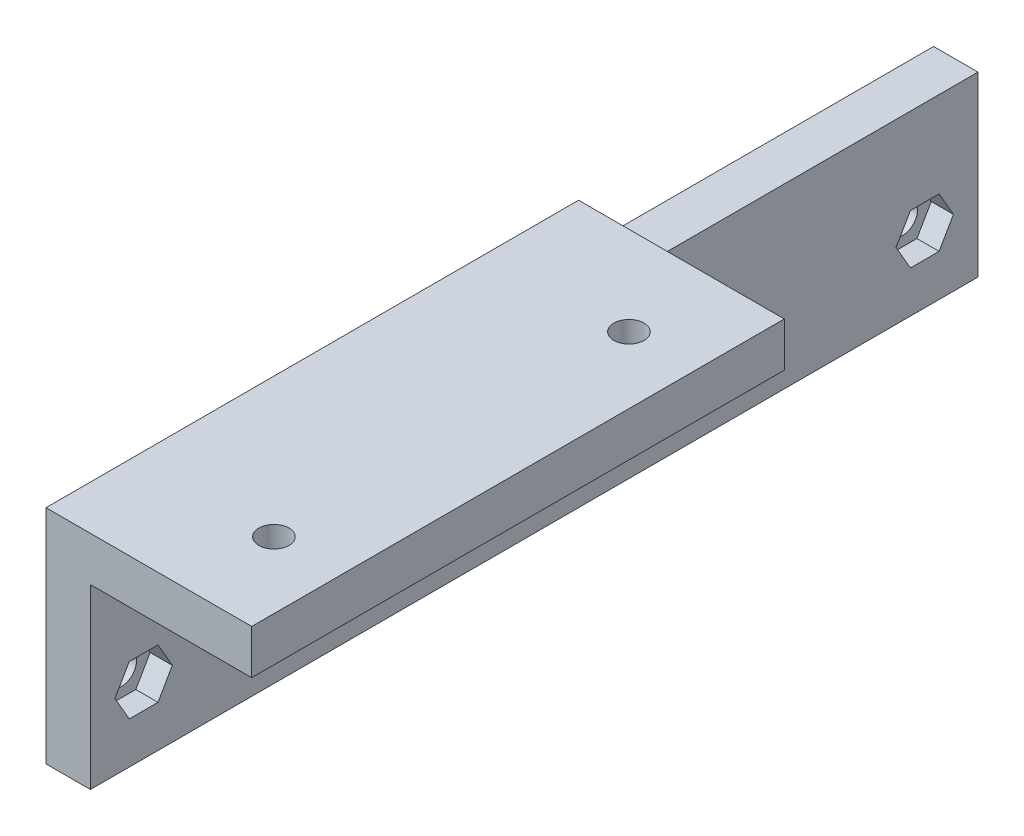
ISO-10303-21;
HEADER;
FILE_DESCRIPTION(('STEP AP214'),'2;1');
FILE_NAME('part.step','',(''),(''),'','','');
FILE_SCHEMA(('AUTOMOTIVE_DESIGN { 1 0 10303 214 1 1 1 1 }'));
ENDSEC;
DATA;
#1=APPLICATION_CONTEXT('core data for automotive mechanical design processes');
#2=APPLICATION_PROTOCOL_DEFINITION('international standard','automotive_design',2000,#1);
#3=PRODUCT_CONTEXT('',#1,'mechanical');
#4=PRODUCT('Part','Part','',(#3));
#5=PRODUCT_RELATED_PRODUCT_CATEGORY('part','',(#4));
#6=PRODUCT_DEFINITION_FORMATION('','',#4);
#7=PRODUCT_DEFINITION_CONTEXT('part definition',#1,'design');
#8=PRODUCT_DEFINITION('design','',#6,#7);
#9=PRODUCT_DEFINITION_SHAPE('','',#8);
#10=(LENGTH_UNIT() NAMED_UNIT(*) SI_UNIT(.MILLI.,.METRE.));
#11=(NAMED_UNIT(*) PLANE_ANGLE_UNIT() SI_UNIT($,.RADIAN.));
#12=(NAMED_UNIT(*) SI_UNIT($,.STERADIAN.) SOLID_ANGLE_UNIT());
#13=UNCERTAINTY_MEASURE_WITH_UNIT(LENGTH_MEASURE(1.E-05),#10,'distance_accuracy_value','');
#14=(GEOMETRIC_REPRESENTATION_CONTEXT(3) GLOBAL_UNCERTAINTY_ASSIGNED_CONTEXT((#13)) GLOBAL_UNIT_ASSIGNED_CONTEXT((#10,
#11,#12)) REPRESENTATION_CONTEXT('',''));
#15=CARTESIAN_POINT('',(0.,0.,0.));
#16=DIRECTION('',(0.,0.,1.));
#17=DIRECTION('',(1.,0.,0.));
#18=AXIS2_PLACEMENT_3D('',#15,#16,#17);
#19=CARTESIAN_POINT('',(2.5,20.,0.));
#20=DIRECTION('',(0.,1.,0.));
#21=DIRECTION('',(0.,0.,1.));
#22=AXIS2_PLACEMENT_3D('',#19,#20,#21);
#23=PLANE('',#22);
#24=DIRECTION('',(0.,0.,-1.));
#25=VECTOR('',#24,1.);
#26=CARTESIAN_POINT('',(7.5,20.,0.));
#27=LINE('',#26,#25);
#28=CARTESIAN_POINT('',(7.5,20.,-60.));
#29=VERTEX_POINT('',#28);
#30=CARTESIAN_POINT('',(7.5,20.,-100.));
#31=VERTEX_POINT('',#30);
#32=EDGE_CURVE('E234',#29,#31,#27,.T.);
#33=ORIENTED_EDGE('',*,*,#32,.T.);
#34=DIRECTION('',(1.,0.,0.));
#35=VECTOR('',#34,1.);
#36=CARTESIAN_POINT('',(2.5,20.,-100.));
#37=LINE('',#36,#35);
#38=CARTESIAN_POINT('',(2.5,20.,-100.));
#39=VERTEX_POINT('',#38);
#40=EDGE_CURVE('E219',#39,#31,#37,.T.);
#41=ORIENTED_EDGE('',*,*,#40,.F.);
#42=DIRECTION('',(0.,0.,-1.));
#43=VECTOR('',#42,1.);
#44=CARTESIAN_POINT('',(2.5,20.,0.));
#45=LINE('',#44,#43);
#46=CARTESIAN_POINT('',(2.5,20.,-60.));
#47=VERTEX_POINT('',#46);
#48=EDGE_CURVE('E200',#47,#39,#45,.T.);
#49=ORIENTED_EDGE('',*,*,#48,.F.);
#50=DIRECTION('',(-1.,0.,0.));
#51=VECTOR('',#50,1.);
#52=CARTESIAN_POINT('',(5.,20.,-60.));
#53=LINE('',#52,#51);
#54=EDGE_CURVE('E11',#29,#47,#53,.T.);
#55=ORIENTED_EDGE('',*,*,#54,.F.);
#56=EDGE_LOOP('',(#33,#41,#49,#55));
#57=FACE_BOUND('',#56,.T.);
#58=ADVANCED_FACE('F37',(#57),#23,.T.);
#59=CARTESIAN_POINT('',(5.,0.,0.));
#60=DIRECTION('',(-1.,0.,0.));
#61=DIRECTION('',(0.,0.,-1.));
#62=AXIS2_PLACEMENT_3D('',#59,#60,#61);
#63=PLANE('',#62);
#64=CARTESIAN_POINT('',(5.,7.49999999999999,-6.00000000000001));
#65=DIRECTION('',(1.,0.,0.));
#66=DIRECTION('',(0.,0.,-1.));
#67=AXIS2_PLACEMENT_3D('',#64,#65,#66);
#68=CIRCLE('',#67,1.7);
#69=CARTESIAN_POINT('',(5.,7.49999999999999,-7.70000000000001));
#70=VERTEX_POINT('',#69);
#71=EDGE_CURVE('E212',#70,#70,#68,.T.);
#72=ORIENTED_EDGE('',*,*,#71,.F.);
#73=EDGE_LOOP('',(#72));
#74=FACE_BOUND('',#73,.T.);
#75=DIRECTION('',(0.,0.866025403784439,-0.5));
#76=VECTOR('',#75,1.);
#77=CARTESIAN_POINT('',(5.,-2.12307621135332,-3.6772758664048));
#78=LINE('',#77,#76);
#79=CARTESIAN_POINT('',(5.,4.69999999999999,-7.61658075373096));
#80=VERTEX_POINT('',#79);
#81=CARTESIAN_POINT('',(5.,7.49999999999999,-9.23316150746191));
#82=VERTEX_POINT('',#81);
#83=EDGE_CURVE('E286',#80,#82,#78,.T.);
#84=ORIENTED_EDGE('',*,*,#83,.T.);
#85=DIRECTION('',(0.,0.866025403784439,0.5));
#86=VECTOR('',#85,1.);
#87=CARTESIAN_POINT('',(5.,5.87307621135332,-10.1724663947881));
#88=LINE('',#87,#86);
#89=CARTESIAN_POINT('',(5.,10.3,-7.61658075373096));
#90=VERTEX_POINT('',#89);
#91=EDGE_CURVE('E300',#82,#90,#88,.T.);
#92=ORIENTED_EDGE('',*,*,#91,.T.);
#93=DIRECTION('',(0.,0.,1.));
#94=VECTOR('',#93,1.);
#95=CARTESIAN_POINT('',(5.,10.3,0.));
#96=LINE('',#95,#94);
#97=CARTESIAN_POINT('',(5.,10.3,-4.38341924626905));
#98=VERTEX_POINT('',#97);
#99=EDGE_CURVE('E297',#90,#98,#96,.T.);
#100=ORIENTED_EDGE('',*,*,#99,.T.);
#101=DIRECTION('',(0.,-0.866025403784439,0.5));
#102=VECTOR('',#101,1.);
#103=CARTESIAN_POINT('',(5.,0.676923788646683,1.17246639478807));
#104=LINE('',#103,#102);
#105=CARTESIAN_POINT('',(5.,7.49999999999999,-2.76683849253809));
#106=VERTEX_POINT('',#105);
#107=EDGE_CURVE('E294',#98,#106,#104,.T.);
#108=ORIENTED_EDGE('',*,*,#107,.T.);
#109=DIRECTION('',(0.,-0.866025403784439,-0.5));
#110=VECTOR('',#109,1.);
#111=CARTESIAN_POINT('',(5.,3.07307621135331,-5.32272413359521));
#112=LINE('',#111,#110);
#113=CARTESIAN_POINT('',(5.,4.69999999999999,-4.38341924626905));
#114=VERTEX_POINT('',#113);
#115=EDGE_CURVE('E291',#106,#114,#112,.T.);
#116=ORIENTED_EDGE('',*,*,#115,.T.);
#117=DIRECTION('',(0.,0.,-1.));
#118=VECTOR('',#117,1.);
#119=CARTESIAN_POINT('',(5.,4.69999999999999,0.));
#120=LINE('',#119,#118);
#121=EDGE_CURVE('E289',#114,#80,#120,.T.);
#122=ORIENTED_EDGE('',*,*,#121,.T.);
#123=EDGE_LOOP('',(#84,#92,#100,#108,#116,#122));
#124=FACE_BOUND('',#123,.T.);
#125=ADVANCED_FACE('F347',(#74,#124),#63,.F.);
#126=CARTESIAN_POINT('',(5.,7.50000000000001,-94.));
#127=DIRECTION('',(1.,0.,0.));
#128=DIRECTION('',(0.,0.,-1.));
#129=AXIS2_PLACEMENT_3D('',#126,#127,#128);
#130=CIRCLE('',#129,1.70000000000001);
#131=CARTESIAN_POINT('',(5.,7.50000000000001,-95.7));
#132=VERTEX_POINT('',#131);
#133=EDGE_CURVE('E215',#132,#132,#130,.T.);
#134=ORIENTED_EDGE('',*,*,#133,.F.);
#135=EDGE_LOOP('',(#134));
#136=FACE_BOUND('',#135,.T.);
#137=DIRECTION('',(0.,-0.866025403784438,-0.500000000000002));
#138=VECTOR('',#137,1.);
#139=CARTESIAN_POINT('',(5.,41.1781939778687,-71.3227241335951));
#140=LINE('',#139,#138);
#141=CARTESIAN_POINT('',(5.,7.50000000000002,-90.7668384925381));
#142=VERTEX_POINT('',#141);
#143=CARTESIAN_POINT('',(5.,4.69999999999998,-92.383419246269));
#144=VERTEX_POINT('',#143);
#145=EDGE_CURVE('E303',#142,#144,#140,.T.);
#146=ORIENTED_EDGE('',*,*,#145,.T.);
#147=DIRECTION('',(0.,0.,-1.));
#148=VECTOR('',#147,1.);
#149=CARTESIAN_POINT('',(5.,4.70000000000001,0.));
#150=LINE('',#149,#148);
#151=CARTESIAN_POINT('',(5.,4.69999999999998,-95.6165807537309));
#152=VERTEX_POINT('',#151);
#153=EDGE_CURVE('E240',#144,#152,#150,.T.);
#154=ORIENTED_EDGE('',*,*,#153,.T.);
#155=DIRECTION('',(0.,0.866025403784438,-0.5));
#156=VECTOR('',#155,1.);
#157=CARTESIAN_POINT('',(5.,-40.2281939778686,-69.6772758664048));
#158=LINE('',#157,#156);
#159=CARTESIAN_POINT('',(5.,7.50000000000001,-97.2331615074619));
#160=VERTEX_POINT('',#159);
#161=EDGE_CURVE('E243',#152,#160,#158,.T.);
#162=ORIENTED_EDGE('',*,*,#161,.T.);
#163=DIRECTION('',(0.,0.866025403784439,0.499999999999999));
#164=VECTOR('',#163,1.);
#165=CARTESIAN_POINT('',(5.,43.9781939778686,-76.1724663947882));
#166=LINE('',#165,#164);
#167=CARTESIAN_POINT('',(5.,10.3,-95.6165807537309));
#168=VERTEX_POINT('',#167);
#169=EDGE_CURVE('E312',#160,#168,#166,.T.);
#170=ORIENTED_EDGE('',*,*,#169,.T.);
#171=DIRECTION('',(0.,0.,1.));
#172=VECTOR('',#171,1.);
#173=CARTESIAN_POINT('',(5.,10.3,0.));
#174=LINE('',#173,#172);
#175=CARTESIAN_POINT('',(5.,10.3,-92.383419246269));
#176=VERTEX_POINT('',#175);
#177=EDGE_CURVE('E309',#168,#176,#174,.T.);
#178=ORIENTED_EDGE('',*,*,#177,.T.);
#179=DIRECTION('',(0.,-0.866025403784438,0.500000000000002));
#180=VECTOR('',#179,1.);
#181=CARTESIAN_POINT('',(5.,-37.4281939778687,-64.8275336052118));
#182=LINE('',#181,#180);
#183=EDGE_CURVE('E306',#176,#142,#182,.T.);
#184=ORIENTED_EDGE('',*,*,#183,.T.);
#185=EDGE_LOOP('',(#146,#154,#162,#170,#178,#184));
#186=FACE_BOUND('',#185,.T.);
#187=ADVANCED_FACE('F378',(#136,#186),#63,.F.);
#188=CARTESIAN_POINT('',(2.5,0.,0.));
#189=DIRECTION('',(0.,1.,0.));
#190=DIRECTION('',(0.,0.,1.));
#191=AXIS2_PLACEMENT_3D('',#188,#189,#190);
#192=PLANE('',#191);
#193=DIRECTION('',(1.,0.,0.));
#194=VECTOR('',#193,1.);
#195=CARTESIAN_POINT('',(2.5,0.,0.));
#196=LINE('',#195,#194);
#197=CARTESIAN_POINT('',(2.5,0.,0.));
#198=VERTEX_POINT('',#197);
#199=CARTESIAN_POINT('',(7.5,0.,0.));
#200=VERTEX_POINT('',#199);
#201=EDGE_CURVE('E211',#198,#200,#196,.T.);
#202=ORIENTED_EDGE('',*,*,#201,.F.);
#203=DIRECTION('',(0.,0.,-1.));
#204=VECTOR('',#203,1.);
#205=CARTESIAN_POINT('',(2.5,0.,0.));
#206=LINE('',#205,#204);
#207=CARTESIAN_POINT('',(2.5,0.,-100.));
#208=VERTEX_POINT('',#207);
#209=EDGE_CURVE('E197',#198,#208,#206,.T.);
#210=ORIENTED_EDGE('',*,*,#209,.T.);
#211=DIRECTION('',(1.,0.,0.));
#212=VECTOR('',#211,1.);
#213=CARTESIAN_POINT('',(2.5,0.,-100.));
#214=LINE('',#213,#212);
#215=CARTESIAN_POINT('',(7.5,0.,-100.));
#216=VERTEX_POINT('',#215);
#217=EDGE_CURVE('E41',#208,#216,#214,.T.);
#218=ORIENTED_EDGE('',*,*,#217,.T.);
#219=DIRECTION('',(0.,0.,-1.));
#220=VECTOR('',#219,1.);
#221=CARTESIAN_POINT('',(7.5,0.,0.));
#222=LINE('',#221,#220);
#223=EDGE_CURVE('E229',#200,#216,#222,.T.);
#224=ORIENTED_EDGE('',*,*,#223,.F.);
#225=EDGE_LOOP('',(#202,#210,#218,#224));
#226=FACE_BOUND('',#225,.T.);
#227=ADVANCED_FACE('F39',(#226),#192,.F.);
#228=CARTESIAN_POINT('',(2.5,0.,-100.));
#229=DIRECTION('',(0.,0.,1.));
#230=DIRECTION('',(0.,-1.,0.));
#231=AXIS2_PLACEMENT_3D('',#228,#229,#230);
#232=PLANE('',#231);
#233=ORIENTED_EDGE('',*,*,#217,.F.);
#234=DIRECTION('',(0.,1.,0.));
#235=VECTOR('',#234,1.);
#236=CARTESIAN_POINT('',(2.5,0.,-100.));
#237=LINE('',#236,#235);
#238=EDGE_CURVE('E205',#208,#39,#237,.T.);
#239=ORIENTED_EDGE('',*,*,#238,.T.);
#240=ORIENTED_EDGE('',*,*,#40,.T.);
#241=DIRECTION('',(0.,1.,0.));
#242=VECTOR('',#241,1.);
#243=CARTESIAN_POINT('',(7.5,0.,-100.));
#244=LINE('',#243,#242);
#245=EDGE_CURVE('E231',#216,#31,#244,.T.);
#246=ORIENTED_EDGE('',*,*,#245,.F.);
#247=EDGE_LOOP('',(#233,#239,#240,#246));
#248=FACE_BOUND('',#247,.T.);
#249=ADVANCED_FACE('F230',(#248),#232,.F.);
#250=CARTESIAN_POINT('',(2.5,7.49999999999999,-6.00000000000001));
#251=DIRECTION('',(1.,0.,0.));
#252=DIRECTION('',(0.,0.,1.));
#253=AXIS2_PLACEMENT_3D('',#250,#251,#252);
#254=CYLINDRICAL_SURFACE('',#253,1.7);
#255=CARTESIAN_POINT('',(2.5,7.49999999999999,-6.00000000000001));
#256=DIRECTION('',(1.,0.,0.));
#257=DIRECTION('',(0.,0.,-1.));
#258=AXIS2_PLACEMENT_3D('',#255,#256,#257);
#259=CIRCLE('',#258,1.7);
#260=CARTESIAN_POINT('',(2.5,7.49999999999999,-7.70000000000001));
#261=VERTEX_POINT('',#260);
#262=EDGE_CURVE('E199',#261,#261,#259,.T.);
#263=ORIENTED_EDGE('',*,*,#262,.F.);
#264=EDGE_LOOP('',(#263));
#265=FACE_BOUND('',#264,.T.);
#266=ORIENTED_EDGE('',*,*,#71,.T.);
#267=EDGE_LOOP('',(#266));
#268=FACE_BOUND('',#267,.T.);
#269=ADVANCED_FACE('F384',(#265,#268),#254,.F.);
#270=CARTESIAN_POINT('',(2.5,0.,0.));
#271=DIRECTION('',(0.,0.,1.));
#272=DIRECTION('',(-1.,0.,0.));
#273=AXIS2_PLACEMENT_3D('',#270,#271,#272);
#274=PLANE('',#273);
#275=DIRECTION('',(0.,1.,0.));
#276=VECTOR('',#275,1.);
#277=CARTESIAN_POINT('',(2.5,0.,0.));
#278=LINE('',#277,#276);
#279=CARTESIAN_POINT('',(2.5,25.,0.));
#280=VERTEX_POINT('',#279);
#281=EDGE_CURVE('E187',#198,#280,#278,.T.);
#282=ORIENTED_EDGE('',*,*,#281,.F.);
#283=ORIENTED_EDGE('',*,*,#201,.T.);
#284=DIRECTION('',(0.,1.,0.));
#285=VECTOR('',#284,1.);
#286=CARTESIAN_POINT('',(7.5,0.,0.));
#287=LINE('',#286,#285);
#288=CARTESIAN_POINT('',(7.5,20.,0.));
#289=VERTEX_POINT('',#288);
#290=EDGE_CURVE('E239',#200,#289,#287,.T.);
#291=ORIENTED_EDGE('',*,*,#290,.T.);
#292=DIRECTION('',(1.,0.,0.));
#293=VECTOR('',#292,1.);
#294=CARTESIAN_POINT('',(5.,20.,0.));
#295=LINE('',#294,#293);
#296=CARTESIAN_POINT('',(25.675,20.,0.));
#297=VERTEX_POINT('',#296);
#298=EDGE_CURVE('E722',#289,#297,#295,.T.);
#299=ORIENTED_EDGE('',*,*,#298,.T.);
#300=DIRECTION('',(0.,-1.,0.));
#301=VECTOR('',#300,1.);
#302=CARTESIAN_POINT('',(25.675,25.,0.));
#303=LINE('',#302,#301);
#304=CARTESIAN_POINT('',(25.675,25.,0.));
#305=VERTEX_POINT('',#304);
#306=EDGE_CURVE('E191',#305,#297,#303,.T.);
#307=ORIENTED_EDGE('',*,*,#306,.F.);
#308=DIRECTION('',(1.,0.,0.));
#309=VECTOR('',#308,1.);
#310=CARTESIAN_POINT('',(5.,25.,0.));
#311=LINE('',#310,#309);
#312=EDGE_CURVE('E178',#280,#305,#311,.T.);
#313=ORIENTED_EDGE('',*,*,#312,.F.);
#314=EDGE_LOOP('',(#282,#283,#291,#299,#307,#313));
#315=FACE_BOUND('',#314,.T.);
#316=ADVANCED_FACE('F185',(#315),#274,.T.);
#317=CARTESIAN_POINT('',(2.5,7.50000000000001,-94.));
#318=DIRECTION('',(1.,0.,0.));
#319=DIRECTION('',(0.,0.,1.));
#320=AXIS2_PLACEMENT_3D('',#317,#318,#319);
#321=CYLINDRICAL_SURFACE('',#320,1.70000000000001);
#322=CARTESIAN_POINT('',(2.5,7.50000000000001,-94.));
#323=DIRECTION('',(1.,0.,0.));
#324=DIRECTION('',(0.,0.,-1.));
#325=AXIS2_PLACEMENT_3D('',#322,#323,#324);
#326=CIRCLE('',#325,1.70000000000001);
#327=CARTESIAN_POINT('',(2.5,7.50000000000001,-95.7));
#328=VERTEX_POINT('',#327);
#329=EDGE_CURVE('E203',#328,#328,#326,.T.);
#330=ORIENTED_EDGE('',*,*,#329,.F.);
#331=EDGE_LOOP('',(#330));
#332=FACE_BOUND('',#331,.T.);
#333=ORIENTED_EDGE('',*,*,#133,.T.);
#334=EDGE_LOOP('',(#333));
#335=FACE_BOUND('',#334,.T.);
#336=ADVANCED_FACE('F401',(#332,#335),#321,.F.);
#337=CARTESIAN_POINT('',(2.5,0.,0.));
#338=DIRECTION('',(-1.,0.,0.));
#339=DIRECTION('',(0.,0.,-1.));
#340=AXIS2_PLACEMENT_3D('',#337,#338,#339);
#341=PLANE('',#340);
#342=ORIENTED_EDGE('',*,*,#209,.F.);
#343=ORIENTED_EDGE('',*,*,#281,.T.);
#344=DIRECTION('',(0.,0.,-1.));
#345=VECTOR('',#344,1.);
#346=CARTESIAN_POINT('',(2.5,25.,0.));
#347=LINE('',#346,#345);
#348=CARTESIAN_POINT('',(2.5,25.,-60.));
#349=VERTEX_POINT('',#348);
#350=EDGE_CURVE('E174',#280,#349,#347,.T.);
#351=ORIENTED_EDGE('',*,*,#350,.T.);
#352=DIRECTION('',(0.,-1.,0.));
#353=VECTOR('',#352,1.);
#354=CARTESIAN_POINT('',(2.5,25.,-60.));
#355=LINE('',#354,#353);
#356=EDGE_CURVE('E54',#349,#47,#355,.T.);
#357=ORIENTED_EDGE('',*,*,#356,.T.);
#358=ORIENTED_EDGE('',*,*,#48,.T.);
#359=ORIENTED_EDGE('',*,*,#238,.F.);
#360=EDGE_LOOP('',(#342,#343,#351,#357,#358,#359));
#361=FACE_BOUND('',#360,.T.);
#362=ORIENTED_EDGE('',*,*,#262,.T.);
#363=EDGE_LOOP('',(#362));
#364=FACE_BOUND('',#363,.T.);
#365=ORIENTED_EDGE('',*,*,#329,.T.);
#366=EDGE_LOOP('',(#365));
#367=FACE_BOUND('',#366,.T.);
#368=ADVANCED_FACE('F194',(#361,#364,#367),#341,.T.);
#369=CARTESIAN_POINT('',(7.5,41.1781939778687,-71.3227241335951));
#370=DIRECTION('',(0.,-0.500000000000002,0.866025403784438));
#371=DIRECTION('',(0.,-0.866025403784438,-0.500000000000002));
#372=AXIS2_PLACEMENT_3D('',#369,#370,#371);
#373=PLANE('',#372);
#374=ORIENTED_EDGE('',*,*,#145,.F.);
#375=DIRECTION('',(-1.,0.,0.));
#376=VECTOR('',#375,1.);
#377=CARTESIAN_POINT('',(7.5,7.50000000000002,-90.7668384925381));
#378=LINE('',#377,#376);
#379=CARTESIAN_POINT('',(7.5,7.50000000000002,-90.7668384925381));
#380=VERTEX_POINT('',#379);
#381=EDGE_CURVE('E326',#380,#142,#378,.T.);
#382=ORIENTED_EDGE('',*,*,#381,.F.);
#383=DIRECTION('',(0.,-0.866025403784438,-0.500000000000002));
#384=VECTOR('',#383,1.);
#385=CARTESIAN_POINT('',(7.5,41.1781939778687,-71.3227241335951));
#386=LINE('',#385,#384);
#387=CARTESIAN_POINT('',(7.5,4.69999999999998,-92.383419246269));
#388=VERTEX_POINT('',#387);
#389=EDGE_CURVE('E269',#380,#388,#386,.T.);
#390=ORIENTED_EDGE('',*,*,#389,.T.);
#391=DIRECTION('',(-1.,0.,0.));
#392=VECTOR('',#391,1.);
#393=CARTESIAN_POINT('',(7.5,4.69999999999998,-92.383419246269));
#394=LINE('',#393,#392);
#395=EDGE_CURVE('E216',#388,#144,#394,.T.);
#396=ORIENTED_EDGE('',*,*,#395,.T.);
#397=EDGE_LOOP('',(#374,#382,#390,#396));
#398=FACE_BOUND('',#397,.T.);
#399=ADVANCED_FACE('F408',(#398),#373,.F.);
#400=CARTESIAN_POINT('',(7.5,4.70000000000001,0.));
#401=DIRECTION('',(0.,-1.,0.));
#402=DIRECTION('',(0.,0.,-1.));
#403=AXIS2_PLACEMENT_3D('',#400,#401,#402);
#404=PLANE('',#403);
#405=ORIENTED_EDGE('',*,*,#153,.F.);
#406=ORIENTED_EDGE('',*,*,#395,.F.);
#407=DIRECTION('',(0.,0.,-1.));
#408=VECTOR('',#407,1.);
#409=CARTESIAN_POINT('',(7.5,4.70000000000001,0.));
#410=LINE('',#409,#408);
#411=CARTESIAN_POINT('',(7.5,4.69999999999998,-95.6165807537309));
#412=VERTEX_POINT('',#411);
#413=EDGE_CURVE('E283',#388,#412,#410,.T.);
#414=ORIENTED_EDGE('',*,*,#413,.T.);
#415=DIRECTION('',(-1.,0.,0.));
#416=VECTOR('',#415,1.);
#417=CARTESIAN_POINT('',(7.5,4.69999999999998,-95.6165807537309));
#418=LINE('',#417,#416);
#419=EDGE_CURVE('E318',#412,#152,#418,.T.);
#420=ORIENTED_EDGE('',*,*,#419,.T.);
#421=EDGE_LOOP('',(#405,#406,#414,#420));
#422=FACE_BOUND('',#421,.T.);
#423=ADVANCED_FACE('F515',(#422),#404,.F.);
#424=CARTESIAN_POINT('',(7.5,-40.2281939778686,-69.6772758664048));
#425=DIRECTION('',(0.,-0.5,-0.866025403784438));
#426=DIRECTION('',(0.,0.866025403784438,-0.5));
#427=AXIS2_PLACEMENT_3D('',#424,#425,#426);
#428=PLANE('',#427);
#429=ORIENTED_EDGE('',*,*,#161,.F.);
#430=ORIENTED_EDGE('',*,*,#419,.F.);
#431=DIRECTION('',(0.,0.866025403784438,-0.5));
#432=VECTOR('',#431,1.);
#433=CARTESIAN_POINT('',(7.5,-40.2281939778686,-69.6772758664048));
#434=LINE('',#433,#432);
#435=CARTESIAN_POINT('',(7.5,7.50000000000001,-97.2331615074619));
#436=VERTEX_POINT('',#435);
#437=EDGE_CURVE('E280',#412,#436,#434,.T.);
#438=ORIENTED_EDGE('',*,*,#437,.T.);
#439=DIRECTION('',(-1.,0.,0.));
#440=VECTOR('',#439,1.);
#441=CARTESIAN_POINT('',(7.5,7.50000000000001,-97.2331615074619));
#442=LINE('',#441,#440);
#443=EDGE_CURVE('E320',#436,#160,#442,.T.);
#444=ORIENTED_EDGE('',*,*,#443,.T.);
#445=EDGE_LOOP('',(#429,#430,#438,#444));
#446=FACE_BOUND('',#445,.T.);
#447=ADVANCED_FACE('F524',(#446),#428,.F.);
#448=CARTESIAN_POINT('',(7.5,43.9781939778686,-76.1724663947882));
#449=DIRECTION('',(0.,0.499999999999999,-0.866025403784439));
#450=DIRECTION('',(0.,0.866025403784439,0.499999999999999));
#451=AXIS2_PLACEMENT_3D('',#448,#449,#450);
#452=PLANE('',#451);
#453=ORIENTED_EDGE('',*,*,#169,.F.);
#454=ORIENTED_EDGE('',*,*,#443,.F.);
#455=DIRECTION('',(0.,0.866025403784439,0.499999999999999));
#456=VECTOR('',#455,1.);
#457=CARTESIAN_POINT('',(7.5,43.9781939778686,-76.1724663947882));
#458=LINE('',#457,#456);
#459=CARTESIAN_POINT('',(7.5,10.3,-95.6165807537309));
#460=VERTEX_POINT('',#459);
#461=EDGE_CURVE('E277',#436,#460,#458,.T.);
#462=ORIENTED_EDGE('',*,*,#461,.T.);
#463=DIRECTION('',(-1.,0.,0.));
#464=VECTOR('',#463,1.);
#465=CARTESIAN_POINT('',(7.5,10.3,-95.6165807537309));
#466=LINE('',#465,#464);
#467=EDGE_CURVE('E322',#460,#168,#466,.T.);
#468=ORIENTED_EDGE('',*,*,#467,.T.);
#469=EDGE_LOOP('',(#453,#454,#462,#468));
#470=FACE_BOUND('',#469,.T.);
#471=ADVANCED_FACE('F533',(#470),#452,.F.);
#472=CARTESIAN_POINT('',(7.5,10.3,0.));
#473=DIRECTION('',(0.,1.,0.));
#474=DIRECTION('',(0.,0.,1.));
#475=AXIS2_PLACEMENT_3D('',#472,#473,#474);
#476=PLANE('',#475);
#477=ORIENTED_EDGE('',*,*,#177,.F.);
#478=ORIENTED_EDGE('',*,*,#467,.F.);
#479=DIRECTION('',(0.,0.,1.));
#480=VECTOR('',#479,1.);
#481=CARTESIAN_POINT('',(7.5,10.3,0.));
#482=LINE('',#481,#480);
#483=CARTESIAN_POINT('',(7.5,10.3,-92.383419246269));
#484=VERTEX_POINT('',#483);
#485=EDGE_CURVE('E274',#460,#484,#482,.T.);
#486=ORIENTED_EDGE('',*,*,#485,.T.);
#487=DIRECTION('',(-1.,0.,0.));
#488=VECTOR('',#487,1.);
#489=CARTESIAN_POINT('',(7.5,10.3,-92.383419246269));
#490=LINE('',#489,#488);
#491=EDGE_CURVE('E324',#484,#176,#490,.T.);
#492=ORIENTED_EDGE('',*,*,#491,.T.);
#493=EDGE_LOOP('',(#477,#478,#486,#492));
#494=FACE_BOUND('',#493,.T.);
#495=ADVANCED_FACE('F542',(#494),#476,.F.);
#496=CARTESIAN_POINT('',(7.5,-2.12307621135332,-3.6772758664048));
#497=DIRECTION('',(0.,-0.5,-0.866025403784439));
#498=DIRECTION('',(0.,0.866025403784439,-0.5));
#499=AXIS2_PLACEMENT_3D('',#496,#497,#498);
#500=PLANE('',#499);
#501=ORIENTED_EDGE('',*,*,#83,.F.);
#502=DIRECTION('',(-1.,0.,0.));
#503=VECTOR('',#502,1.);
#504=CARTESIAN_POINT('',(7.5,4.69999999999999,-7.61658075373096));
#505=LINE('',#504,#503);
#506=CARTESIAN_POINT('',(7.5,4.69999999999999,-7.61658075373096));
#507=VERTEX_POINT('',#506);
#508=EDGE_CURVE('E61',#507,#80,#505,.T.);
#509=ORIENTED_EDGE('',*,*,#508,.F.);
#510=DIRECTION('',(0.,0.866025403784439,-0.5));
#511=VECTOR('',#510,1.);
#512=CARTESIAN_POINT('',(7.5,-2.12307621135332,-3.6772758664048));
#513=LINE('',#512,#511);
#514=CARTESIAN_POINT('',(7.5,7.49999999999999,-9.23316150746191));
#515=VERTEX_POINT('',#514);
#516=EDGE_CURVE('E252',#507,#515,#513,.T.);
#517=ORIENTED_EDGE('',*,*,#516,.T.);
#518=DIRECTION('',(-1.,0.,0.));
#519=VECTOR('',#518,1.);
#520=CARTESIAN_POINT('',(7.5,7.49999999999999,-9.23316150746191));
#521=LINE('',#520,#519);
#522=EDGE_CURVE('E328',#515,#82,#521,.T.);
#523=ORIENTED_EDGE('',*,*,#522,.T.);
#524=EDGE_LOOP('',(#501,#509,#517,#523));
#525=FACE_BOUND('',#524,.T.);
#526=ADVANCED_FACE('F358',(#525),#500,.F.);
#527=CARTESIAN_POINT('',(7.5,5.87307621135332,-10.1724663947881));
#528=DIRECTION('',(0.,0.5,-0.866025403784439));
#529=DIRECTION('',(0.,0.866025403784439,0.5));
#530=AXIS2_PLACEMENT_3D('',#527,#528,#529);
#531=PLANE('',#530);
#532=ORIENTED_EDGE('',*,*,#91,.F.);
#533=ORIENTED_EDGE('',*,*,#522,.F.);
#534=DIRECTION('',(0.,0.866025403784439,0.5));
#535=VECTOR('',#534,1.);
#536=CARTESIAN_POINT('',(7.5,5.87307621135332,-10.1724663947881));
#537=LINE('',#536,#535);
#538=CARTESIAN_POINT('',(7.5,10.3,-7.61658075373096));
#539=VERTEX_POINT('',#538);
#540=EDGE_CURVE('E266',#515,#539,#537,.T.);
#541=ORIENTED_EDGE('',*,*,#540,.T.);
#542=DIRECTION('',(-1.,0.,0.));
#543=VECTOR('',#542,1.);
#544=CARTESIAN_POINT('',(7.5,10.3,-7.61658075373096));
#545=LINE('',#544,#543);
#546=EDGE_CURVE('E330',#539,#90,#545,.T.);
#547=ORIENTED_EDGE('',*,*,#546,.T.);
#548=EDGE_LOOP('',(#532,#533,#541,#547));
#549=FACE_BOUND('',#548,.T.);
#550=ADVANCED_FACE('F361',(#549),#531,.F.);
#551=CARTESIAN_POINT('',(7.5,10.3,0.));
#552=DIRECTION('',(0.,1.,0.));
#553=DIRECTION('',(0.,0.,1.));
#554=AXIS2_PLACEMENT_3D('',#551,#552,#553);
#555=PLANE('',#554);
#556=ORIENTED_EDGE('',*,*,#99,.F.);
#557=ORIENTED_EDGE('',*,*,#546,.F.);
#558=DIRECTION('',(0.,0.,1.));
#559=VECTOR('',#558,1.);
#560=CARTESIAN_POINT('',(7.5,10.3,0.));
#561=LINE('',#560,#559);
#562=CARTESIAN_POINT('',(7.5,10.3,-4.38341924626905));
#563=VERTEX_POINT('',#562);
#564=EDGE_CURVE('E263',#539,#563,#561,.T.);
#565=ORIENTED_EDGE('',*,*,#564,.T.);
#566=DIRECTION('',(-1.,0.,0.));
#567=VECTOR('',#566,1.);
#568=CARTESIAN_POINT('',(7.5,10.3,-4.38341924626905));
#569=LINE('',#568,#567);
#570=EDGE_CURVE('E332',#563,#98,#569,.T.);
#571=ORIENTED_EDGE('',*,*,#570,.T.);
#572=EDGE_LOOP('',(#556,#557,#565,#571));
#573=FACE_BOUND('',#572,.T.);
#574=ADVANCED_FACE('F363',(#573),#555,.F.);
#575=CARTESIAN_POINT('',(7.5,0.676923788646683,1.17246639478807));
#576=DIRECTION('',(0.,0.5,0.866025403784439));
#577=DIRECTION('',(0.,-0.866025403784439,0.5));
#578=AXIS2_PLACEMENT_3D('',#575,#576,#577);
#579=PLANE('',#578);
#580=ORIENTED_EDGE('',*,*,#107,.F.);
#581=ORIENTED_EDGE('',*,*,#570,.F.);
#582=DIRECTION('',(0.,-0.866025403784439,0.5));
#583=VECTOR('',#582,1.);
#584=CARTESIAN_POINT('',(7.5,0.676923788646683,1.17246639478807));
#585=LINE('',#584,#583);
#586=CARTESIAN_POINT('',(7.5,7.49999999999999,-2.76683849253809));
#587=VERTEX_POINT('',#586);
#588=EDGE_CURVE('E260',#563,#587,#585,.T.);
#589=ORIENTED_EDGE('',*,*,#588,.T.);
#590=DIRECTION('',(-1.,0.,0.));
#591=VECTOR('',#590,1.);
#592=CARTESIAN_POINT('',(7.5,7.49999999999999,-2.76683849253809));
#593=LINE('',#592,#591);
#594=EDGE_CURVE('E334',#587,#106,#593,.T.);
#595=ORIENTED_EDGE('',*,*,#594,.T.);
#596=EDGE_LOOP('',(#580,#581,#589,#595));
#597=FACE_BOUND('',#596,.T.);
#598=ADVANCED_FACE('F352',(#597),#579,.F.);
#599=CARTESIAN_POINT('',(7.5,3.07307621135331,-5.32272413359521));
#600=DIRECTION('',(0.,-0.5,0.866025403784439));
#601=DIRECTION('',(0.,-0.866025403784439,-0.5));
#602=AXIS2_PLACEMENT_3D('',#599,#600,#601);
#603=PLANE('',#602);
#604=ORIENTED_EDGE('',*,*,#115,.F.);
#605=ORIENTED_EDGE('',*,*,#594,.F.);
#606=DIRECTION('',(0.,-0.866025403784439,-0.5));
#607=VECTOR('',#606,1.);
#608=CARTESIAN_POINT('',(7.5,3.07307621135331,-5.32272413359521));
#609=LINE('',#608,#607);
#610=CARTESIAN_POINT('',(7.5,4.69999999999999,-4.38341924626905));
#611=VERTEX_POINT('',#610);
#612=EDGE_CURVE('E257',#587,#611,#609,.T.);
#613=ORIENTED_EDGE('',*,*,#612,.T.);
#614=DIRECTION('',(-1.,0.,0.));
#615=VECTOR('',#614,1.);
#616=CARTESIAN_POINT('',(7.5,4.69999999999999,-4.38341924626905));
#617=LINE('',#616,#615);
#618=EDGE_CURVE('E336',#611,#114,#617,.T.);
#619=ORIENTED_EDGE('',*,*,#618,.T.);
#620=EDGE_LOOP('',(#604,#605,#613,#619));
#621=FACE_BOUND('',#620,.T.);
#622=ADVANCED_FACE('F342',(#621),#603,.F.);
#623=CARTESIAN_POINT('',(7.5,4.69999999999999,0.));
#624=DIRECTION('',(0.,-1.,0.));
#625=DIRECTION('',(0.,0.,-1.));
#626=AXIS2_PLACEMENT_3D('',#623,#624,#625);
#627=PLANE('',#626);
#628=ORIENTED_EDGE('',*,*,#121,.F.);
#629=ORIENTED_EDGE('',*,*,#618,.F.);
#630=DIRECTION('',(0.,0.,-1.));
#631=VECTOR('',#630,1.);
#632=CARTESIAN_POINT('',(7.5,4.69999999999999,0.));
#633=LINE('',#632,#631);
#634=EDGE_CURVE('E255',#611,#507,#633,.T.);
#635=ORIENTED_EDGE('',*,*,#634,.T.);
#636=ORIENTED_EDGE('',*,*,#508,.T.);
#637=EDGE_LOOP('',(#628,#629,#635,#636));
#638=FACE_BOUND('',#637,.T.);
#639=ADVANCED_FACE('F344',(#638),#627,.F.);
#640=CARTESIAN_POINT('',(7.5,-37.4281939778687,-64.8275336052118));
#641=DIRECTION('',(0.,0.500000000000002,0.866025403784438));
#642=DIRECTION('',(0.,-0.866025403784438,0.500000000000002));
#643=AXIS2_PLACEMENT_3D('',#640,#641,#642);
#644=PLANE('',#643);
#645=ORIENTED_EDGE('',*,*,#183,.F.);
#646=ORIENTED_EDGE('',*,*,#491,.F.);
#647=DIRECTION('',(0.,-0.866025403784438,0.500000000000002));
#648=VECTOR('',#647,1.);
#649=CARTESIAN_POINT('',(7.5,-37.4281939778687,-64.8275336052118));
#650=LINE('',#649,#648);
#651=EDGE_CURVE('E272',#484,#380,#650,.T.);
#652=ORIENTED_EDGE('',*,*,#651,.T.);
#653=ORIENTED_EDGE('',*,*,#381,.T.);
#654=EDGE_LOOP('',(#645,#646,#652,#653));
#655=FACE_BOUND('',#654,.T.);
#656=ADVANCED_FACE('F586',(#655),#644,.F.);
#657=CARTESIAN_POINT('',(7.5,0.,0.));
#658=DIRECTION('',(-1.,0.,0.));
#659=DIRECTION('',(0.,0.,-1.));
#660=AXIS2_PLACEMENT_3D('',#657,#658,#659);
#661=PLANE('',#660);
#662=ORIENTED_EDGE('',*,*,#223,.T.);
#663=ORIENTED_EDGE('',*,*,#245,.T.);
#664=ORIENTED_EDGE('',*,*,#32,.F.);
#665=EDGE_CURVE('E248',#289,#29,#27,.T.);
#666=ORIENTED_EDGE('',*,*,#665,.F.);
#667=ORIENTED_EDGE('',*,*,#290,.F.);
#668=EDGE_LOOP('',(#662,#663,#664,#666,#667));
#669=FACE_BOUND('',#668,.T.);
#670=ORIENTED_EDGE('',*,*,#516,.F.);
#671=ORIENTED_EDGE('',*,*,#634,.F.);
#672=ORIENTED_EDGE('',*,*,#612,.F.);
#673=ORIENTED_EDGE('',*,*,#588,.F.);
#674=ORIENTED_EDGE('',*,*,#564,.F.);
#675=ORIENTED_EDGE('',*,*,#540,.F.);
#676=EDGE_LOOP('',(#670,#671,#672,#673,#674,#675));
#677=FACE_BOUND('',#676,.T.);
#678=ORIENTED_EDGE('',*,*,#389,.F.);
#679=ORIENTED_EDGE('',*,*,#651,.F.);
#680=ORIENTED_EDGE('',*,*,#485,.F.);
#681=ORIENTED_EDGE('',*,*,#461,.F.);
#682=ORIENTED_EDGE('',*,*,#437,.F.);
#683=ORIENTED_EDGE('',*,*,#413,.F.);
#684=EDGE_LOOP('',(#678,#679,#680,#681,#682,#683));
#685=FACE_BOUND('',#684,.T.);
#686=ADVANCED_FACE('F236',(#669,#677,#685),#661,.F.);
#687=CARTESIAN_POINT('',(5.,25.,-60.));
#688=DIRECTION('',(0.,0.,-1.));
#689=DIRECTION('',(1.,0.,0.));
#690=AXIS2_PLACEMENT_3D('',#687,#688,#689);
#691=PLANE('',#690);
#692=CARTESIAN_POINT('',(25.675,20.,-60.));
#693=VERTEX_POINT('',#692);
#694=EDGE_CURVE('E47',#693,#29,#53,.T.);
#695=ORIENTED_EDGE('',*,*,#694,.T.);
#696=ORIENTED_EDGE('',*,*,#54,.T.);
#697=ORIENTED_EDGE('',*,*,#356,.F.);
#698=DIRECTION('',(-1.,0.,0.));
#699=VECTOR('',#698,1.);
#700=CARTESIAN_POINT('',(5.,25.,-60.));
#701=LINE('',#700,#699);
#702=CARTESIAN_POINT('',(25.675,25.,-60.));
#703=VERTEX_POINT('',#702);
#704=EDGE_CURVE('E181',#703,#349,#701,.T.);
#705=ORIENTED_EDGE('',*,*,#704,.F.);
#706=DIRECTION('',(0.,-1.,0.));
#707=VECTOR('',#706,1.);
#708=CARTESIAN_POINT('',(25.675,25.,-60.));
#709=LINE('',#708,#707);
#710=EDGE_CURVE('E718',#703,#693,#709,.T.);
#711=ORIENTED_EDGE('',*,*,#710,.T.);
#712=EDGE_LOOP('',(#695,#696,#697,#705,#711));
#713=FACE_BOUND('',#712,.T.);
#714=ADVANCED_FACE('F602',(#713),#691,.T.);
#715=CARTESIAN_POINT('',(25.675,25.,0.));
#716=DIRECTION('',(1.,0.,0.));
#717=DIRECTION('',(0.,0.,1.));
#718=AXIS2_PLACEMENT_3D('',#715,#716,#717);
#719=PLANE('',#718);
#720=DIRECTION('',(0.,0.,-1.));
#721=VECTOR('',#720,1.);
#722=CARTESIAN_POINT('',(25.675,20.,0.));
#723=LINE('',#722,#721);
#724=EDGE_CURVE('E712',#297,#693,#723,.T.);
#725=ORIENTED_EDGE('',*,*,#724,.T.);
#726=ORIENTED_EDGE('',*,*,#710,.F.);
#727=DIRECTION('',(0.,0.,-1.));
#728=VECTOR('',#727,1.);
#729=CARTESIAN_POINT('',(25.675,25.,0.));
#730=LINE('',#729,#728);
#731=EDGE_CURVE('E728',#305,#703,#730,.T.);
#732=ORIENTED_EDGE('',*,*,#731,.F.);
#733=ORIENTED_EDGE('',*,*,#306,.T.);
#734=EDGE_LOOP('',(#725,#726,#732,#733));
#735=FACE_BOUND('',#734,.T.);
#736=ADVANCED_FACE('F613',(#735),#719,.T.);
#737=CARTESIAN_POINT('',(18.175,25.,-9.99999999999999));
#738=DIRECTION('',(0.,-1.,0.));
#739=DIRECTION('',(0.,0.,-1.));
#740=AXIS2_PLACEMENT_3D('',#737,#738,#739);
#741=CYLINDRICAL_SURFACE('',#740,1.7);
#742=CARTESIAN_POINT('',(18.175,25.,-9.99999999999999));
#743=DIRECTION('',(0.,-1.,0.));
#744=DIRECTION('',(0.,0.,1.));
#745=AXIS2_PLACEMENT_3D('',#742,#743,#744);
#746=CIRCLE('',#745,1.7);
#747=CARTESIAN_POINT('',(18.175,25.,-8.3));
#748=VERTEX_POINT('',#747);
#749=EDGE_CURVE('E192',#748,#748,#746,.T.);
#750=ORIENTED_EDGE('',*,*,#749,.F.);
#751=EDGE_LOOP('',(#750));
#752=FACE_BOUND('',#751,.T.);
#753=CARTESIAN_POINT('',(18.175,20.,-9.99999999999999));
#754=DIRECTION('',(0.,-1.,0.));
#755=DIRECTION('',(0.,0.,1.));
#756=AXIS2_PLACEMENT_3D('',#753,#754,#755);
#757=CIRCLE('',#756,1.7);
#758=CARTESIAN_POINT('',(18.175,20.,-8.3));
#759=VERTEX_POINT('',#758);
#760=EDGE_CURVE('E707',#759,#759,#757,.T.);
#761=ORIENTED_EDGE('',*,*,#760,.T.);
#762=EDGE_LOOP('',(#761));
#763=FACE_BOUND('',#762,.T.);
#764=ADVANCED_FACE('F622',(#752,#763),#741,.F.);
#765=CARTESIAN_POINT('',(18.175,25.,-50.));
#766=DIRECTION('',(0.,-1.,0.));
#767=DIRECTION('',(0.,0.,-1.));
#768=AXIS2_PLACEMENT_3D('',#765,#766,#767);
#769=CYLINDRICAL_SURFACE('',#768,1.7);
#770=CARTESIAN_POINT('',(18.175,25.,-50.));
#771=DIRECTION('',(0.,-1.,0.));
#772=DIRECTION('',(0.,0.,1.));
#773=AXIS2_PLACEMENT_3D('',#770,#771,#772);
#774=CIRCLE('',#773,1.7);
#775=CARTESIAN_POINT('',(18.175,25.,-48.3));
#776=VERTEX_POINT('',#775);
#777=EDGE_CURVE('E719',#776,#776,#774,.T.);
#778=ORIENTED_EDGE('',*,*,#777,.F.);
#779=EDGE_LOOP('',(#778));
#780=FACE_BOUND('',#779,.T.);
#781=CARTESIAN_POINT('',(18.175,20.,-50.));
#782=DIRECTION('',(0.,-1.,0.));
#783=DIRECTION('',(0.,0.,1.));
#784=AXIS2_PLACEMENT_3D('',#781,#782,#783);
#785=CIRCLE('',#784,1.7);
#786=CARTESIAN_POINT('',(18.175,20.,-48.3));
#787=VERTEX_POINT('',#786);
#788=EDGE_CURVE('E710',#787,#787,#785,.T.);
#789=ORIENTED_EDGE('',*,*,#788,.T.);
#790=EDGE_LOOP('',(#789));
#791=FACE_BOUND('',#790,.T.);
#792=ADVANCED_FACE('F631',(#780,#791),#769,.F.);
#793=CARTESIAN_POINT('',(5.,25.,0.));
#794=DIRECTION('',(0.,1.,0.));
#795=DIRECTION('',(0.,0.,1.));
#796=AXIS2_PLACEMENT_3D('',#793,#794,#795);
#797=PLANE('',#796);
#798=ORIENTED_EDGE('',*,*,#749,.T.);
#799=EDGE_LOOP('',(#798));
#800=FACE_BOUND('',#799,.T.);
#801=ORIENTED_EDGE('',*,*,#312,.T.);
#802=ORIENTED_EDGE('',*,*,#731,.T.);
#803=ORIENTED_EDGE('',*,*,#704,.T.);
#804=ORIENTED_EDGE('',*,*,#350,.F.);
#805=EDGE_LOOP('',(#801,#802,#803,#804));
#806=FACE_BOUND('',#805,.T.);
#807=ORIENTED_EDGE('',*,*,#777,.T.);
#808=EDGE_LOOP('',(#807));
#809=FACE_BOUND('',#808,.T.);
#810=ADVANCED_FACE('F176',(#800,#806,#809),#797,.T.);
#811=CARTESIAN_POINT('',(5.,20.,0.));
#812=DIRECTION('',(0.,1.,0.));
#813=DIRECTION('',(0.,0.,1.));
#814=AXIS2_PLACEMENT_3D('',#811,#812,#813);
#815=PLANE('',#814);
#816=ORIENTED_EDGE('',*,*,#665,.T.);
#817=ORIENTED_EDGE('',*,*,#694,.F.);
#818=ORIENTED_EDGE('',*,*,#724,.F.);
#819=ORIENTED_EDGE('',*,*,#298,.F.);
#820=EDGE_LOOP('',(#816,#817,#818,#819));
#821=FACE_BOUND('',#820,.T.);
#822=ORIENTED_EDGE('',*,*,#760,.F.);
#823=EDGE_LOOP('',(#822));
#824=FACE_BOUND('',#823,.T.);
#825=ORIENTED_EDGE('',*,*,#788,.F.);
#826=EDGE_LOOP('',(#825));
#827=FACE_BOUND('',#826,.T.);
#828=ADVANCED_FACE('F648',(#821,#824,#827),#815,.F.);
#829=CLOSED_SHELL('',(#58,#125,#187,#227,#249,#269,#316,#336,#368,#399,#423,#447,#471,#495,#526,
#550,#574,#598,#622,#639,#656,#686,#714,#736,#764,#792,#810,#828));
#830=MANIFOLD_SOLID_BREP('B2',#829);
#831=ADVANCED_BREP_SHAPE_REPRESENTATION('',(#18,#830),#14);
#832=SHAPE_DEFINITION_REPRESENTATION(#9,#831);
ENDSEC;
END-ISO-10303-21;
